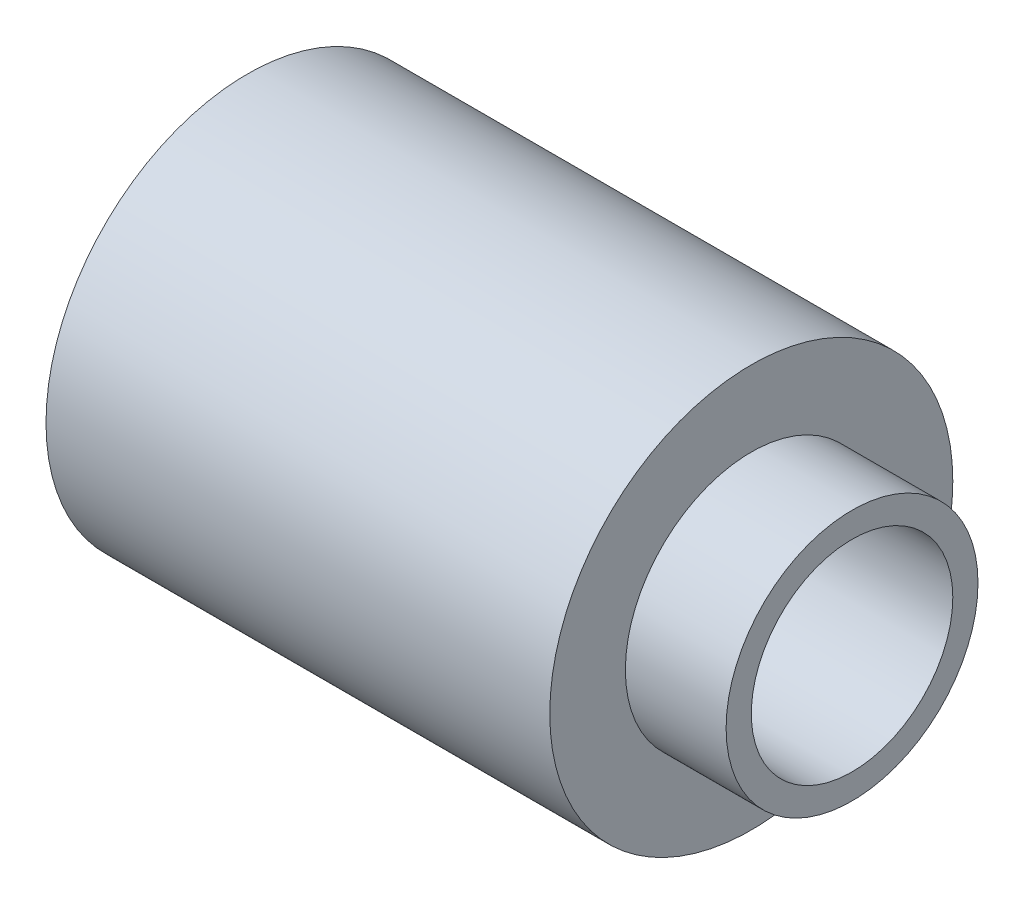
ISO-10303-21;
HEADER;
FILE_DESCRIPTION(('STEP AP214'),'2;1');
FILE_NAME('part.step','',(''),(''),'','','');
FILE_SCHEMA(('AUTOMOTIVE_DESIGN { 1 0 10303 214 1 1 1 1 }'));
ENDSEC;
DATA;
#1=APPLICATION_CONTEXT('core data for automotive mechanical design processes');
#2=APPLICATION_PROTOCOL_DEFINITION('international standard','automotive_design',2000,#1);
#3=PRODUCT_CONTEXT('',#1,'mechanical');
#4=PRODUCT('Part','Part','',(#3));
#5=PRODUCT_RELATED_PRODUCT_CATEGORY('part','',(#4));
#6=PRODUCT_DEFINITION_FORMATION('','',#4);
#7=PRODUCT_DEFINITION_CONTEXT('part definition',#1,'design');
#8=PRODUCT_DEFINITION('design','',#6,#7);
#9=PRODUCT_DEFINITION_SHAPE('','',#8);
#10=(LENGTH_UNIT() NAMED_UNIT(*) SI_UNIT(.MILLI.,.METRE.));
#11=(NAMED_UNIT(*) PLANE_ANGLE_UNIT() SI_UNIT($,.RADIAN.));
#12=(NAMED_UNIT(*) SI_UNIT($,.STERADIAN.) SOLID_ANGLE_UNIT());
#13=UNCERTAINTY_MEASURE_WITH_UNIT(LENGTH_MEASURE(1.E-05),#10,'distance_accuracy_value','');
#14=(GEOMETRIC_REPRESENTATION_CONTEXT(3) GLOBAL_UNCERTAINTY_ASSIGNED_CONTEXT((#13)) GLOBAL_UNIT_ASSIGNED_CONTEXT((#10,
#11,#12)) REPRESENTATION_CONTEXT('',''));
#15=CARTESIAN_POINT('',(0.,0.,0.));
#16=DIRECTION('',(0.,0.,1.));
#17=DIRECTION('',(1.,0.,0.));
#18=AXIS2_PLACEMENT_3D('',#15,#16,#17);
#19=CARTESIAN_POINT('',(10.,0.,0.));
#20=DIRECTION('',(1.,0.,0.));
#21=DIRECTION('',(0.,0.,-1.));
#22=AXIS2_PLACEMENT_3D('',#19,#20,#21);
#23=PLANE('',#22);
#24=CARTESIAN_POINT('',(10.,0.,0.));
#25=DIRECTION('',(1.,0.,0.));
#26=DIRECTION('',(0.,0.,-1.));
#27=AXIS2_PLACEMENT_3D('',#24,#25,#26);
#28=CIRCLE('',#27,4.);
#29=CARTESIAN_POINT('',(10.,0.,-4.));
#30=VERTEX_POINT('',#29);
#31=EDGE_CURVE('E10',#30,#30,#28,.T.);
#32=ORIENTED_EDGE('',*,*,#31,.T.);
#33=EDGE_LOOP('',(#32));
#34=FACE_BOUND('',#33,.T.);
#35=CARTESIAN_POINT('',(10.,0.,0.));
#36=DIRECTION('',(1.,0.,0.));
#37=DIRECTION('',(0.,0.,-1.));
#38=AXIS2_PLACEMENT_3D('',#35,#36,#37);
#39=CIRCLE('',#38,2.5);
#40=CARTESIAN_POINT('',(10.,0.,-2.5));
#41=VERTEX_POINT('',#40);
#42=EDGE_CURVE('E47',#41,#41,#39,.T.);
#43=ORIENTED_EDGE('',*,*,#42,.F.);
#44=EDGE_LOOP('',(#43));
#45=FACE_BOUND('',#44,.T.);
#46=ADVANCED_FACE('F31',(#34,#45),#23,.T.);
#47=CARTESIAN_POINT('',(0.,0.,0.));
#48=DIRECTION('',(1.,0.,0.));
#49=DIRECTION('',(0.,0.,-1.));
#50=AXIS2_PLACEMENT_3D('',#47,#48,#49);
#51=PLANE('',#50);
#52=CARTESIAN_POINT('',(0.,0.,0.));
#53=DIRECTION('',(1.,0.,0.));
#54=DIRECTION('',(0.,0.,-1.));
#55=AXIS2_PLACEMENT_3D('',#52,#53,#54);
#56=CIRCLE('',#55,4.);
#57=CARTESIAN_POINT('',(0.,0.,-4.));
#58=VERTEX_POINT('',#57);
#59=EDGE_CURVE('E35',#58,#58,#56,.T.);
#60=ORIENTED_EDGE('',*,*,#59,.F.);
#61=EDGE_LOOP('',(#60));
#62=FACE_BOUND('',#61,.T.);
#63=CARTESIAN_POINT('',(0.,0.,0.));
#64=DIRECTION('',(1.,0.,0.));
#65=DIRECTION('',(0.,0.,-1.));
#66=AXIS2_PLACEMENT_3D('',#63,#64,#65);
#67=CIRCLE('',#66,2.);
#68=CARTESIAN_POINT('',(0.,0.,-2.));
#69=VERTEX_POINT('',#68);
#70=EDGE_CURVE('E42',#69,#69,#67,.T.);
#71=ORIENTED_EDGE('',*,*,#70,.T.);
#72=EDGE_LOOP('',(#71));
#73=FACE_BOUND('',#72,.T.);
#74=ADVANCED_FACE('F72',(#62,#73),#51,.F.);
#75=CARTESIAN_POINT('',(10.,0.,0.));
#76=DIRECTION('',(-1.,0.,0.));
#77=DIRECTION('',(0.,0.,1.));
#78=AXIS2_PLACEMENT_3D('',#75,#76,#77);
#79=CYLINDRICAL_SURFACE('',#78,4.);
#80=ORIENTED_EDGE('',*,*,#31,.F.);
#81=EDGE_LOOP('',(#80));
#82=FACE_BOUND('',#81,.T.);
#83=ORIENTED_EDGE('',*,*,#59,.T.);
#84=EDGE_LOOP('',(#83));
#85=FACE_BOUND('',#84,.T.);
#86=ADVANCED_FACE('F33',(#82,#85),#79,.T.);
#87=CARTESIAN_POINT('',(10.,0.,0.));
#88=DIRECTION('',(-1.,0.,0.));
#89=DIRECTION('',(0.,0.,1.));
#90=AXIS2_PLACEMENT_3D('',#87,#88,#89);
#91=CYLINDRICAL_SURFACE('',#90,2.);
#92=ORIENTED_EDGE('',*,*,#70,.F.);
#93=EDGE_LOOP('',(#92));
#94=FACE_BOUND('',#93,.T.);
#95=CARTESIAN_POINT('',(12.,0.,0.));
#96=DIRECTION('',(1.,0.,0.));
#97=DIRECTION('',(0.,0.,-1.));
#98=AXIS2_PLACEMENT_3D('',#95,#96,#97);
#99=CIRCLE('',#98,2.);
#100=CARTESIAN_POINT('',(12.,0.,-2.));
#101=VERTEX_POINT('',#100);
#102=EDGE_CURVE('E50',#101,#101,#99,.T.);
#103=ORIENTED_EDGE('',*,*,#102,.T.);
#104=EDGE_LOOP('',(#103));
#105=FACE_BOUND('',#104,.T.);
#106=ADVANCED_FACE('F56',(#94,#105),#91,.F.);
#107=CARTESIAN_POINT('',(12.,0.,0.));
#108=DIRECTION('',(1.,0.,0.));
#109=DIRECTION('',(0.,0.,-1.));
#110=AXIS2_PLACEMENT_3D('',#107,#108,#109);
#111=PLANE('',#110);
#112=CARTESIAN_POINT('',(12.,0.,0.));
#113=DIRECTION('',(1.,0.,0.));
#114=DIRECTION('',(0.,0.,-1.));
#115=AXIS2_PLACEMENT_3D('',#112,#113,#114);
#116=CIRCLE('',#115,2.5);
#117=CARTESIAN_POINT('',(12.,0.,-2.5));
#118=VERTEX_POINT('',#117);
#119=EDGE_CURVE('E46',#118,#118,#116,.T.);
#120=ORIENTED_EDGE('',*,*,#119,.T.);
#121=EDGE_LOOP('',(#120));
#122=FACE_BOUND('',#121,.T.);
#123=ORIENTED_EDGE('',*,*,#102,.F.);
#124=EDGE_LOOP('',(#123));
#125=FACE_BOUND('',#124,.T.);
#126=ADVANCED_FACE('F58',(#122,#125),#111,.T.);
#127=CARTESIAN_POINT('',(12.,0.,0.));
#128=DIRECTION('',(-1.,0.,0.));
#129=DIRECTION('',(0.,0.,1.));
#130=AXIS2_PLACEMENT_3D('',#127,#128,#129);
#131=CYLINDRICAL_SURFACE('',#130,2.5);
#132=ORIENTED_EDGE('',*,*,#119,.F.);
#133=EDGE_LOOP('',(#132));
#134=FACE_BOUND('',#133,.T.);
#135=ORIENTED_EDGE('',*,*,#42,.T.);
#136=EDGE_LOOP('',(#135));
#137=FACE_BOUND('',#136,.T.);
#138=ADVANCED_FACE('F60',(#134,#137),#131,.T.);
#139=CLOSED_SHELL('',(#46,#74,#86,#106,#126,#138));
#140=MANIFOLD_SOLID_BREP('B2',#139);
#141=ADVANCED_BREP_SHAPE_REPRESENTATION('',(#18,#140),#14);
#142=SHAPE_DEFINITION_REPRESENTATION(#9,#141);
ENDSEC;
END-ISO-10303-21;
